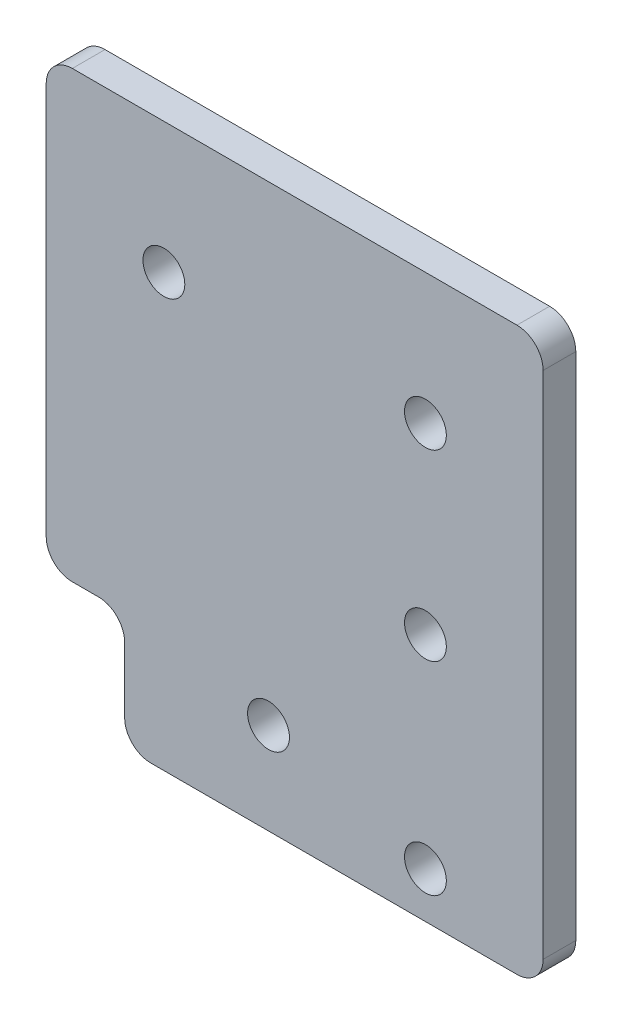
ISO-10303-21;
HEADER;
FILE_DESCRIPTION(('STEP AP214'),'2;1');
FILE_NAME('part.step','',(''),(''),'','','');
FILE_SCHEMA(('AUTOMOTIVE_DESIGN { 1 0 10303 214 1 1 1 1 }'));
ENDSEC;
DATA;
#1=APPLICATION_CONTEXT('core data for automotive mechanical design processes');
#2=APPLICATION_PROTOCOL_DEFINITION('international standard','automotive_design',2000,#1);
#3=PRODUCT_CONTEXT('',#1,'mechanical');
#4=PRODUCT('Part','Part','',(#3));
#5=PRODUCT_RELATED_PRODUCT_CATEGORY('part','',(#4));
#6=PRODUCT_DEFINITION_FORMATION('','',#4);
#7=PRODUCT_DEFINITION_CONTEXT('part definition',#1,'design');
#8=PRODUCT_DEFINITION('design','',#6,#7);
#9=PRODUCT_DEFINITION_SHAPE('','',#8);
#10=(LENGTH_UNIT() NAMED_UNIT(*) SI_UNIT(.MILLI.,.METRE.));
#11=(NAMED_UNIT(*) PLANE_ANGLE_UNIT() SI_UNIT($,.RADIAN.));
#12=(NAMED_UNIT(*) SI_UNIT($,.STERADIAN.) SOLID_ANGLE_UNIT());
#13=UNCERTAINTY_MEASURE_WITH_UNIT(LENGTH_MEASURE(1.E-05),#10,'distance_accuracy_value','');
#14=(GEOMETRIC_REPRESENTATION_CONTEXT(3) GLOBAL_UNCERTAINTY_ASSIGNED_CONTEXT((#13)) GLOBAL_UNIT_ASSIGNED_CONTEXT((#10,
#11,#12)) REPRESENTATION_CONTEXT('',''));
#15=CARTESIAN_POINT('',(0.,0.,0.));
#16=DIRECTION('',(0.,0.,1.));
#17=DIRECTION('',(1.,0.,0.));
#18=AXIS2_PLACEMENT_3D('',#15,#16,#17);
#19=CARTESIAN_POINT('',(0.,0.,2.5));
#20=DIRECTION('',(0.,0.,1.));
#21=DIRECTION('',(1.,0.,0.));
#22=AXIS2_PLACEMENT_3D('',#19,#20,#21);
#23=PLANE('',#22);
#24=CARTESIAN_POINT('',(10.,-7.,2.5));
#25=DIRECTION('',(0.,0.,1.));
#26=DIRECTION('',(1.,0.,0.));
#27=AXIS2_PLACEMENT_3D('',#24,#25,#26);
#28=CIRCLE('',#27,1.6);
#29=CARTESIAN_POINT('',(11.6,-7.,2.5));
#30=VERTEX_POINT('',#29);
#31=EDGE_CURVE('E453',#30,#30,#28,.T.);
#32=ORIENTED_EDGE('',*,*,#31,.F.);
#33=EDGE_LOOP('',(#32));
#34=FACE_BOUND('',#33,.T.);
#35=CARTESIAN_POINT('',(-9.99999999999999,7.,2.5));
#36=DIRECTION('',(0.,0.,1.));
#37=DIRECTION('',(1.,0.,0.));
#38=AXIS2_PLACEMENT_3D('',#35,#36,#37);
#39=CIRCLE('',#38,1.6);
#40=CARTESIAN_POINT('',(-8.39999999999999,7.,2.5));
#41=VERTEX_POINT('',#40);
#42=EDGE_CURVE('E245',#41,#41,#39,.T.);
#43=ORIENTED_EDGE('',*,*,#42,.F.);
#44=EDGE_LOOP('',(#43));
#45=FACE_BOUND('',#44,.T.);
#46=DIRECTION('',(0.,-1.,0.));
#47=VECTOR('',#46,1.);
#48=CARTESIAN_POINT('',(-13.,-26.,2.5));
#49=LINE('',#48,#47);
#50=CARTESIAN_POINT('',(-13.,-19.,2.5));
#51=VERTEX_POINT('',#50);
#52=CARTESIAN_POINT('',(-13.,-24.,2.5));
#53=VERTEX_POINT('',#52);
#54=EDGE_CURVE('E222',#51,#53,#49,.T.);
#55=ORIENTED_EDGE('',*,*,#54,.T.);
#56=CARTESIAN_POINT('',(-11.,-24.,2.5));
#57=DIRECTION('',(0.,0.,1.));
#58=DIRECTION('',(1.,0.,0.));
#59=AXIS2_PLACEMENT_3D('',#56,#57,#58);
#60=CIRCLE('',#59,2.);
#61=CARTESIAN_POINT('',(-11.,-26.,2.5));
#62=VERTEX_POINT('',#61);
#63=EDGE_CURVE('E186',#53,#62,#60,.T.);
#64=ORIENTED_EDGE('',*,*,#63,.T.);
#65=DIRECTION('',(1.,0.,0.));
#66=VECTOR('',#65,1.);
#67=CARTESIAN_POINT('',(-13.,-26.,2.5));
#68=LINE('',#67,#66);
#69=CARTESIAN_POINT('',(17.,-26.,2.5));
#70=VERTEX_POINT('',#69);
#71=EDGE_CURVE('E149',#62,#70,#68,.T.);
#72=ORIENTED_EDGE('',*,*,#71,.T.);
#73=CARTESIAN_POINT('',(17.,-24.,2.5));
#74=DIRECTION('',(0.,0.,1.));
#75=DIRECTION('',(1.,0.,0.));
#76=AXIS2_PLACEMENT_3D('',#73,#74,#75);
#77=CIRCLE('',#76,2.);
#78=CARTESIAN_POINT('',(19.,-24.,2.5));
#79=VERTEX_POINT('',#78);
#80=EDGE_CURVE('E179',#70,#79,#77,.T.);
#81=ORIENTED_EDGE('',*,*,#80,.T.);
#82=DIRECTION('',(0.,1.,0.));
#83=VECTOR('',#82,1.);
#84=CARTESIAN_POINT('',(19.,17.,2.5));
#85=LINE('',#84,#83);
#86=CARTESIAN_POINT('',(19.,15.,2.5));
#87=VERTEX_POINT('',#86);
#88=EDGE_CURVE('E227',#79,#87,#85,.T.);
#89=ORIENTED_EDGE('',*,*,#88,.T.);
#90=CARTESIAN_POINT('',(17.,15.,2.5));
#91=DIRECTION('',(0.,0.,1.));
#92=DIRECTION('',(1.,0.,0.));
#93=AXIS2_PLACEMENT_3D('',#90,#91,#92);
#94=CIRCLE('',#93,2.);
#95=CARTESIAN_POINT('',(17.,17.,2.5));
#96=VERTEX_POINT('',#95);
#97=EDGE_CURVE('E61',#87,#96,#94,.T.);
#98=ORIENTED_EDGE('',*,*,#97,.T.);
#99=DIRECTION('',(-1.,0.,0.));
#100=VECTOR('',#99,1.);
#101=CARTESIAN_POINT('',(-19.,17.,2.5));
#102=LINE('',#101,#100);
#103=CARTESIAN_POINT('',(-17.,17.,2.5));
#104=VERTEX_POINT('',#103);
#105=EDGE_CURVE('E168',#96,#104,#102,.T.);
#106=ORIENTED_EDGE('',*,*,#105,.T.);
#107=CARTESIAN_POINT('',(-17.,15.,2.5));
#108=DIRECTION('',(0.,0.,1.));
#109=DIRECTION('',(1.,0.,0.));
#110=AXIS2_PLACEMENT_3D('',#107,#108,#109);
#111=CIRCLE('',#110,2.);
#112=CARTESIAN_POINT('',(-19.,15.,2.5));
#113=VERTEX_POINT('',#112);
#114=EDGE_CURVE('E182',#104,#113,#111,.T.);
#115=ORIENTED_EDGE('',*,*,#114,.T.);
#116=DIRECTION('',(0.,-1.,0.));
#117=VECTOR('',#116,1.);
#118=CARTESIAN_POINT('',(-19.,17.,2.5));
#119=LINE('',#118,#117);
#120=CARTESIAN_POINT('',(-19.,-15.,2.5));
#121=VERTEX_POINT('',#120);
#122=EDGE_CURVE('E167',#113,#121,#119,.T.);
#123=ORIENTED_EDGE('',*,*,#122,.T.);
#124=CARTESIAN_POINT('',(-17.,-15.,2.5));
#125=DIRECTION('',(0.,0.,1.));
#126=DIRECTION('',(1.,0.,0.));
#127=AXIS2_PLACEMENT_3D('',#124,#125,#126);
#128=CIRCLE('',#127,2.);
#129=CARTESIAN_POINT('',(-17.,-17.,2.5));
#130=VERTEX_POINT('',#129);
#131=EDGE_CURVE('E184',#121,#130,#128,.T.);
#132=ORIENTED_EDGE('',*,*,#131,.T.);
#133=DIRECTION('',(1.,0.,0.));
#134=VECTOR('',#133,1.);
#135=CARTESIAN_POINT('',(-19.,-17.,2.5));
#136=LINE('',#135,#134);
#137=CARTESIAN_POINT('',(-15.,-17.,2.5));
#138=VERTEX_POINT('',#137);
#139=EDGE_CURVE('E223',#130,#138,#136,.T.);
#140=ORIENTED_EDGE('',*,*,#139,.T.);
#141=CARTESIAN_POINT('',(-15.,-19.,2.5));
#142=DIRECTION('',(0.,0.,1.));
#143=DIRECTION('',(1.,0.,0.));
#144=AXIS2_PLACEMENT_3D('',#141,#142,#143);
#145=CIRCLE('',#144,2.);
#146=EDGE_CURVE('E11',#138,#51,#145,.F.);
#147=ORIENTED_EDGE('',*,*,#146,.T.);
#148=EDGE_LOOP('',(#55,#64,#72,#81,#89,#98,#106,#115,#123,#132,#140,#147));
#149=FACE_BOUND('',#148,.T.);
#150=CARTESIAN_POINT('',(10.,6.99999999999999,2.5));
#151=DIRECTION('',(0.,0.,1.));
#152=DIRECTION('',(1.,0.,0.));
#153=AXIS2_PLACEMENT_3D('',#150,#151,#152);
#154=CIRCLE('',#153,1.6);
#155=CARTESIAN_POINT('',(11.6,6.99999999999999,2.5));
#156=VERTEX_POINT('',#155);
#157=EDGE_CURVE('E235',#156,#156,#154,.T.);
#158=ORIENTED_EDGE('',*,*,#157,.F.);
#159=EDGE_LOOP('',(#158));
#160=FACE_BOUND('',#159,.T.);
#161=CARTESIAN_POINT('',(10.,-22.5,2.5));
#162=DIRECTION('',(0.,0.,1.));
#163=DIRECTION('',(1.,0.,0.));
#164=AXIS2_PLACEMENT_3D('',#161,#162,#163);
#165=CIRCLE('',#164,1.6);
#166=CARTESIAN_POINT('',(11.6,-22.5,2.5));
#167=VERTEX_POINT('',#166);
#168=EDGE_CURVE('E457',#167,#167,#165,.T.);
#169=ORIENTED_EDGE('',*,*,#168,.F.);
#170=EDGE_LOOP('',(#169));
#171=FACE_BOUND('',#170,.T.);
#172=CARTESIAN_POINT('',(-1.99999999999999,-19.,2.5));
#173=DIRECTION('',(0.,0.,1.));
#174=DIRECTION('',(1.,0.,0.));
#175=AXIS2_PLACEMENT_3D('',#172,#173,#174);
#176=CIRCLE('',#175,1.6);
#177=CARTESIAN_POINT('',(-0.399999999999992,-19.,2.5));
#178=VERTEX_POINT('',#177);
#179=EDGE_CURVE('E448',#178,#178,#176,.T.);
#180=ORIENTED_EDGE('',*,*,#179,.F.);
#181=EDGE_LOOP('',(#180));
#182=FACE_BOUND('',#181,.T.);
#183=ADVANCED_FACE('F39',(#34,#45,#149,#160,#171,#182),#23,.T.);
#184=CARTESIAN_POINT('',(0.,0.,0.));
#185=DIRECTION('',(0.,0.,1.));
#186=DIRECTION('',(1.,0.,0.));
#187=AXIS2_PLACEMENT_3D('',#184,#185,#186);
#188=PLANE('',#187);
#189=DIRECTION('',(1.,0.,0.));
#190=VECTOR('',#189,1.);
#191=CARTESIAN_POINT('',(-13.,-26.,0.));
#192=LINE('',#191,#190);
#193=CARTESIAN_POINT('',(-11.,-26.,0.));
#194=VERTEX_POINT('',#193);
#195=CARTESIAN_POINT('',(17.,-26.,0.));
#196=VERTEX_POINT('',#195);
#197=EDGE_CURVE('E146',#194,#196,#192,.T.);
#198=ORIENTED_EDGE('',*,*,#197,.F.);
#199=CARTESIAN_POINT('',(-11.,-24.,0.));
#200=DIRECTION('',(0.,0.,1.));
#201=DIRECTION('',(1.,0.,0.));
#202=AXIS2_PLACEMENT_3D('',#199,#200,#201);
#203=CIRCLE('',#202,2.);
#204=CARTESIAN_POINT('',(-13.,-24.,0.));
#205=VERTEX_POINT('',#204);
#206=EDGE_CURVE('E129',#194,#205,#203,.F.);
#207=ORIENTED_EDGE('',*,*,#206,.T.);
#208=DIRECTION('',(0.,-1.,0.));
#209=VECTOR('',#208,1.);
#210=CARTESIAN_POINT('',(-13.,-26.,0.));
#211=LINE('',#210,#209);
#212=CARTESIAN_POINT('',(-13.,-19.,0.));
#213=VERTEX_POINT('',#212);
#214=EDGE_CURVE('E157',#213,#205,#211,.T.);
#215=ORIENTED_EDGE('',*,*,#214,.F.);
#216=CARTESIAN_POINT('',(-15.,-19.,0.));
#217=DIRECTION('',(0.,0.,1.));
#218=DIRECTION('',(1.,0.,0.));
#219=AXIS2_PLACEMENT_3D('',#216,#217,#218);
#220=CIRCLE('',#219,2.);
#221=CARTESIAN_POINT('',(-15.,-17.,0.));
#222=VERTEX_POINT('',#221);
#223=EDGE_CURVE('E47',#213,#222,#220,.T.);
#224=ORIENTED_EDGE('',*,*,#223,.T.);
#225=DIRECTION('',(1.,0.,0.));
#226=VECTOR('',#225,1.);
#227=CARTESIAN_POINT('',(-19.,-17.,0.));
#228=LINE('',#227,#226);
#229=CARTESIAN_POINT('',(-17.,-17.,0.));
#230=VERTEX_POINT('',#229);
#231=EDGE_CURVE('E162',#230,#222,#228,.T.);
#232=ORIENTED_EDGE('',*,*,#231,.F.);
#233=CARTESIAN_POINT('',(-17.,-15.,0.));
#234=DIRECTION('',(0.,0.,1.));
#235=DIRECTION('',(1.,0.,0.));
#236=AXIS2_PLACEMENT_3D('',#233,#234,#235);
#237=CIRCLE('',#236,2.);
#238=CARTESIAN_POINT('',(-19.,-15.,0.));
#239=VERTEX_POINT('',#238);
#240=EDGE_CURVE('E140',#230,#239,#237,.F.);
#241=ORIENTED_EDGE('',*,*,#240,.T.);
#242=DIRECTION('',(0.,-1.,0.));
#243=VECTOR('',#242,1.);
#244=CARTESIAN_POINT('',(-19.,17.,0.));
#245=LINE('',#244,#243);
#246=CARTESIAN_POINT('',(-19.,15.,0.));
#247=VERTEX_POINT('',#246);
#248=EDGE_CURVE('E216',#247,#239,#245,.T.);
#249=ORIENTED_EDGE('',*,*,#248,.F.);
#250=CARTESIAN_POINT('',(-17.,15.,0.));
#251=DIRECTION('',(0.,0.,1.));
#252=DIRECTION('',(1.,0.,0.));
#253=AXIS2_PLACEMENT_3D('',#250,#251,#252);
#254=CIRCLE('',#253,2.);
#255=CARTESIAN_POINT('',(-17.,17.,0.));
#256=VERTEX_POINT('',#255);
#257=EDGE_CURVE('E173',#247,#256,#254,.F.);
#258=ORIENTED_EDGE('',*,*,#257,.T.);
#259=DIRECTION('',(-1.,0.,0.));
#260=VECTOR('',#259,1.);
#261=CARTESIAN_POINT('',(-19.,17.,0.));
#262=LINE('',#261,#260);
#263=CARTESIAN_POINT('',(17.,17.,0.));
#264=VERTEX_POINT('',#263);
#265=EDGE_CURVE('E160',#264,#256,#262,.T.);
#266=ORIENTED_EDGE('',*,*,#265,.F.);
#267=CARTESIAN_POINT('',(17.,15.,0.));
#268=DIRECTION('',(0.,0.,1.));
#269=DIRECTION('',(1.,0.,0.));
#270=AXIS2_PLACEMENT_3D('',#267,#268,#269);
#271=CIRCLE('',#270,2.);
#272=CARTESIAN_POINT('',(19.,15.,0.));
#273=VERTEX_POINT('',#272);
#274=EDGE_CURVE('E171',#264,#273,#271,.F.);
#275=ORIENTED_EDGE('',*,*,#274,.T.);
#276=DIRECTION('',(0.,1.,0.));
#277=VECTOR('',#276,1.);
#278=CARTESIAN_POINT('',(19.,17.,0.));
#279=LINE('',#278,#277);
#280=CARTESIAN_POINT('',(19.,-24.,0.));
#281=VERTEX_POINT('',#280);
#282=EDGE_CURVE('E156',#281,#273,#279,.T.);
#283=ORIENTED_EDGE('',*,*,#282,.F.);
#284=CARTESIAN_POINT('',(17.,-24.,0.));
#285=DIRECTION('',(0.,0.,1.));
#286=DIRECTION('',(1.,0.,0.));
#287=AXIS2_PLACEMENT_3D('',#284,#285,#286);
#288=CIRCLE('',#287,2.);
#289=EDGE_CURVE('E150',#281,#196,#288,.F.);
#290=ORIENTED_EDGE('',*,*,#289,.T.);
#291=EDGE_LOOP('',(#198,#207,#215,#224,#232,#241,#249,#258,#266,#275,#283,#290));
#292=FACE_BOUND('',#291,.T.);
#293=CARTESIAN_POINT('',(10.,6.99999999999999,0.));
#294=DIRECTION('',(0.,0.,1.));
#295=DIRECTION('',(1.,0.,0.));
#296=AXIS2_PLACEMENT_3D('',#293,#294,#295);
#297=CIRCLE('',#296,1.6);
#298=CARTESIAN_POINT('',(11.6,6.99999999999999,0.));
#299=VERTEX_POINT('',#298);
#300=EDGE_CURVE('E240',#299,#299,#297,.T.);
#301=ORIENTED_EDGE('',*,*,#300,.T.);
#302=EDGE_LOOP('',(#301));
#303=FACE_BOUND('',#302,.T.);
#304=CARTESIAN_POINT('',(-9.99999999999999,7.,0.));
#305=DIRECTION('',(0.,0.,1.));
#306=DIRECTION('',(1.,0.,0.));
#307=AXIS2_PLACEMENT_3D('',#304,#305,#306);
#308=CIRCLE('',#307,1.6);
#309=CARTESIAN_POINT('',(-8.39999999999999,7.,0.));
#310=VERTEX_POINT('',#309);
#311=EDGE_CURVE('E248',#310,#310,#308,.T.);
#312=ORIENTED_EDGE('',*,*,#311,.T.);
#313=EDGE_LOOP('',(#312));
#314=FACE_BOUND('',#313,.T.);
#315=CARTESIAN_POINT('',(10.,-22.5,0.));
#316=DIRECTION('',(0.,0.,1.));
#317=DIRECTION('',(1.,0.,0.));
#318=AXIS2_PLACEMENT_3D('',#315,#316,#317);
#319=CIRCLE('',#318,1.6);
#320=CARTESIAN_POINT('',(11.6,-22.5,0.));
#321=VERTEX_POINT('',#320);
#322=EDGE_CURVE('E439',#321,#321,#319,.T.);
#323=ORIENTED_EDGE('',*,*,#322,.T.);
#324=EDGE_LOOP('',(#323));
#325=FACE_BOUND('',#324,.T.);
#326=CARTESIAN_POINT('',(10.,-7.,0.));
#327=DIRECTION('',(0.,0.,1.));
#328=DIRECTION('',(1.,0.,0.));
#329=AXIS2_PLACEMENT_3D('',#326,#327,#328);
#330=CIRCLE('',#329,1.6);
#331=CARTESIAN_POINT('',(11.6,-7.,0.));
#332=VERTEX_POINT('',#331);
#333=EDGE_CURVE('E443',#332,#332,#330,.T.);
#334=ORIENTED_EDGE('',*,*,#333,.T.);
#335=EDGE_LOOP('',(#334));
#336=FACE_BOUND('',#335,.T.);
#337=CARTESIAN_POINT('',(-1.99999999999999,-19.,0.));
#338=DIRECTION('',(0.,0.,1.));
#339=DIRECTION('',(1.,0.,0.));
#340=AXIS2_PLACEMENT_3D('',#337,#338,#339);
#341=CIRCLE('',#340,1.6);
#342=CARTESIAN_POINT('',(-0.399999999999992,-19.,0.));
#343=VERTEX_POINT('',#342);
#344=EDGE_CURVE('E446',#343,#343,#341,.T.);
#345=ORIENTED_EDGE('',*,*,#344,.T.);
#346=EDGE_LOOP('',(#345));
#347=FACE_BOUND('',#346,.T.);
#348=ADVANCED_FACE('F153',(#292,#303,#314,#325,#336,#347),#188,.F.);
#349=CARTESIAN_POINT('',(-19.,17.,2.5));
#350=DIRECTION('',(1.,0.,0.));
#351=DIRECTION('',(0.,0.,-1.));
#352=AXIS2_PLACEMENT_3D('',#349,#350,#351);
#353=PLANE('',#352);
#354=ORIENTED_EDGE('',*,*,#248,.T.);
#355=DIRECTION('',(0.,0.,-1.));
#356=VECTOR('',#355,1.);
#357=CARTESIAN_POINT('',(-19.,-15.,2.5));
#358=LINE('',#357,#356);
#359=EDGE_CURVE('E196',#239,#121,#358,.F.);
#360=ORIENTED_EDGE('',*,*,#359,.T.);
#361=ORIENTED_EDGE('',*,*,#122,.F.);
#362=DIRECTION('',(0.,0.,-1.));
#363=VECTOR('',#362,1.);
#364=CARTESIAN_POINT('',(-19.,15.,2.5));
#365=LINE('',#364,#363);
#366=EDGE_CURVE('E193',#113,#247,#365,.T.);
#367=ORIENTED_EDGE('',*,*,#366,.T.);
#368=EDGE_LOOP('',(#354,#360,#361,#367));
#369=FACE_BOUND('',#368,.T.);
#370=ADVANCED_FACE('F262',(#369),#353,.F.);
#371=CARTESIAN_POINT('',(-19.,-17.,2.5));
#372=DIRECTION('',(0.,1.,0.));
#373=DIRECTION('',(0.,0.,1.));
#374=AXIS2_PLACEMENT_3D('',#371,#372,#373);
#375=PLANE('',#374);
#376=ORIENTED_EDGE('',*,*,#139,.F.);
#377=DIRECTION('',(0.,0.,-1.));
#378=VECTOR('',#377,1.);
#379=CARTESIAN_POINT('',(-17.,-17.,2.5));
#380=LINE('',#379,#378);
#381=EDGE_CURVE('E190',#130,#230,#380,.T.);
#382=ORIENTED_EDGE('',*,*,#381,.T.);
#383=ORIENTED_EDGE('',*,*,#231,.T.);
#384=DIRECTION('',(0.,0.,-1.));
#385=VECTOR('',#384,1.);
#386=CARTESIAN_POINT('',(-15.,-17.,2.5));
#387=LINE('',#386,#385);
#388=EDGE_CURVE('E188',#222,#138,#387,.F.);
#389=ORIENTED_EDGE('',*,*,#388,.T.);
#390=EDGE_LOOP('',(#376,#382,#383,#389));
#391=FACE_BOUND('',#390,.T.);
#392=ADVANCED_FACE('F213',(#391),#375,.F.);
#393=CARTESIAN_POINT('',(-13.,-26.,2.5));
#394=DIRECTION('',(1.,0.,0.));
#395=DIRECTION('',(0.,0.,-1.));
#396=AXIS2_PLACEMENT_3D('',#393,#394,#395);
#397=PLANE('',#396);
#398=ORIENTED_EDGE('',*,*,#214,.T.);
#399=DIRECTION('',(0.,0.,-1.));
#400=VECTOR('',#399,1.);
#401=CARTESIAN_POINT('',(-13.,-24.,2.5));
#402=LINE('',#401,#400);
#403=EDGE_CURVE('E134',#205,#53,#402,.F.);
#404=ORIENTED_EDGE('',*,*,#403,.T.);
#405=ORIENTED_EDGE('',*,*,#54,.F.);
#406=DIRECTION('',(0.,0.,-1.));
#407=VECTOR('',#406,1.);
#408=CARTESIAN_POINT('',(-13.,-19.,0.));
#409=LINE('',#408,#407);
#410=EDGE_CURVE('E139',#51,#213,#409,.T.);
#411=ORIENTED_EDGE('',*,*,#410,.T.);
#412=EDGE_LOOP('',(#398,#404,#405,#411));
#413=FACE_BOUND('',#412,.T.);
#414=ADVANCED_FACE('F225',(#413),#397,.F.);
#415=CARTESIAN_POINT('',(-13.,-26.,2.5));
#416=DIRECTION('',(0.,1.,0.));
#417=DIRECTION('',(0.,0.,1.));
#418=AXIS2_PLACEMENT_3D('',#415,#416,#417);
#419=PLANE('',#418);
#420=ORIENTED_EDGE('',*,*,#71,.F.);
#421=DIRECTION('',(0.,0.,-1.));
#422=VECTOR('',#421,1.);
#423=CARTESIAN_POINT('',(-11.,-26.,2.5));
#424=LINE('',#423,#422);
#425=EDGE_CURVE('E133',#62,#194,#424,.T.);
#426=ORIENTED_EDGE('',*,*,#425,.T.);
#427=ORIENTED_EDGE('',*,*,#197,.T.);
#428=DIRECTION('',(0.,0.,-1.));
#429=VECTOR('',#428,1.);
#430=CARTESIAN_POINT('',(17.,-26.,2.5));
#431=LINE('',#430,#429);
#432=EDGE_CURVE('E151',#196,#70,#431,.F.);
#433=ORIENTED_EDGE('',*,*,#432,.T.);
#434=EDGE_LOOP('',(#420,#426,#427,#433));
#435=FACE_BOUND('',#434,.T.);
#436=ADVANCED_FACE('F145',(#435),#419,.F.);
#437=CARTESIAN_POINT('',(19.,17.,2.5));
#438=DIRECTION('',(-1.,0.,0.));
#439=DIRECTION('',(0.,-1.,0.));
#440=AXIS2_PLACEMENT_3D('',#437,#438,#439);
#441=PLANE('',#440);
#442=ORIENTED_EDGE('',*,*,#282,.T.);
#443=DIRECTION('',(0.,0.,-1.));
#444=VECTOR('',#443,1.);
#445=CARTESIAN_POINT('',(19.,15.,2.5));
#446=LINE('',#445,#444);
#447=EDGE_CURVE('E205',#273,#87,#446,.F.);
#448=ORIENTED_EDGE('',*,*,#447,.T.);
#449=ORIENTED_EDGE('',*,*,#88,.F.);
#450=DIRECTION('',(0.,0.,-1.));
#451=VECTOR('',#450,1.);
#452=CARTESIAN_POINT('',(19.,-24.,2.5));
#453=LINE('',#452,#451);
#454=EDGE_CURVE('E202',#79,#281,#453,.T.);
#455=ORIENTED_EDGE('',*,*,#454,.T.);
#456=EDGE_LOOP('',(#442,#448,#449,#455));
#457=FACE_BOUND('',#456,.T.);
#458=ADVANCED_FACE('F286',(#457),#441,.F.);
#459=CARTESIAN_POINT('',(-19.,17.,2.5));
#460=DIRECTION('',(0.,-1.,0.));
#461=DIRECTION('',(0.,0.,-1.));
#462=AXIS2_PLACEMENT_3D('',#459,#460,#461);
#463=PLANE('',#462);
#464=ORIENTED_EDGE('',*,*,#265,.T.);
#465=DIRECTION('',(0.,0.,-1.));
#466=VECTOR('',#465,1.);
#467=CARTESIAN_POINT('',(-17.,17.,2.5));
#468=LINE('',#467,#466);
#469=EDGE_CURVE('E54',#256,#104,#468,.F.);
#470=ORIENTED_EDGE('',*,*,#469,.T.);
#471=ORIENTED_EDGE('',*,*,#105,.F.);
#472=DIRECTION('',(0.,0.,-1.));
#473=VECTOR('',#472,1.);
#474=CARTESIAN_POINT('',(17.,17.,2.5));
#475=LINE('',#474,#473);
#476=EDGE_CURVE('E198',#96,#264,#475,.T.);
#477=ORIENTED_EDGE('',*,*,#476,.T.);
#478=EDGE_LOOP('',(#464,#470,#471,#477));
#479=FACE_BOUND('',#478,.T.);
#480=ADVANCED_FACE('F259',(#479),#463,.F.);
#481=CARTESIAN_POINT('',(10.,6.99999999999999,2.5));
#482=DIRECTION('',(0.,0.,-1.));
#483=DIRECTION('',(-1.,0.,0.));
#484=AXIS2_PLACEMENT_3D('',#481,#482,#483);
#485=CYLINDRICAL_SURFACE('',#484,1.6);
#486=ORIENTED_EDGE('',*,*,#157,.T.);
#487=EDGE_LOOP('',(#486));
#488=FACE_BOUND('',#487,.T.);
#489=ORIENTED_EDGE('',*,*,#300,.F.);
#490=EDGE_LOOP('',(#489));
#491=FACE_BOUND('',#490,.T.);
#492=ADVANCED_FACE('F281',(#488,#491),#485,.F.);
#493=CARTESIAN_POINT('',(-9.99999999999999,7.,2.5));
#494=DIRECTION('',(0.,0.,-1.));
#495=DIRECTION('',(-1.,0.,0.));
#496=AXIS2_PLACEMENT_3D('',#493,#494,#495);
#497=CYLINDRICAL_SURFACE('',#496,1.6);
#498=ORIENTED_EDGE('',*,*,#42,.T.);
#499=EDGE_LOOP('',(#498));
#500=FACE_BOUND('',#499,.T.);
#501=ORIENTED_EDGE('',*,*,#311,.F.);
#502=EDGE_LOOP('',(#501));
#503=FACE_BOUND('',#502,.T.);
#504=ADVANCED_FACE('F387',(#500,#503),#497,.F.);
#505=CARTESIAN_POINT('',(10.,-22.5,2.5));
#506=DIRECTION('',(0.,0.,-1.));
#507=DIRECTION('',(-1.,0.,0.));
#508=AXIS2_PLACEMENT_3D('',#505,#506,#507);
#509=CYLINDRICAL_SURFACE('',#508,1.6);
#510=ORIENTED_EDGE('',*,*,#168,.T.);
#511=EDGE_LOOP('',(#510));
#512=FACE_BOUND('',#511,.T.);
#513=ORIENTED_EDGE('',*,*,#322,.F.);
#514=EDGE_LOOP('',(#513));
#515=FACE_BOUND('',#514,.T.);
#516=ADVANCED_FACE('F378',(#512,#515),#509,.F.);
#517=CARTESIAN_POINT('',(10.,-7.,2.5));
#518=DIRECTION('',(0.,0.,-1.));
#519=DIRECTION('',(-1.,0.,0.));
#520=AXIS2_PLACEMENT_3D('',#517,#518,#519);
#521=CYLINDRICAL_SURFACE('',#520,1.6);
#522=ORIENTED_EDGE('',*,*,#31,.T.);
#523=EDGE_LOOP('',(#522));
#524=FACE_BOUND('',#523,.T.);
#525=ORIENTED_EDGE('',*,*,#333,.F.);
#526=EDGE_LOOP('',(#525));
#527=FACE_BOUND('',#526,.T.);
#528=ADVANCED_FACE('F369',(#524,#527),#521,.F.);
#529=CARTESIAN_POINT('',(-1.99999999999999,-19.,2.5));
#530=DIRECTION('',(0.,0.,-1.));
#531=DIRECTION('',(-1.,0.,0.));
#532=AXIS2_PLACEMENT_3D('',#529,#530,#531);
#533=CYLINDRICAL_SURFACE('',#532,1.6);
#534=ORIENTED_EDGE('',*,*,#179,.T.);
#535=EDGE_LOOP('',(#534));
#536=FACE_BOUND('',#535,.T.);
#537=ORIENTED_EDGE('',*,*,#344,.F.);
#538=EDGE_LOOP('',(#537));
#539=FACE_BOUND('',#538,.T.);
#540=ADVANCED_FACE('F320',(#536,#539),#533,.F.);
#541=CARTESIAN_POINT('',(-11.,-24.,2.5));
#542=DIRECTION('',(0.,0.,-1.));
#543=DIRECTION('',(-1.,0.,0.));
#544=AXIS2_PLACEMENT_3D('',#541,#542,#543);
#545=CYLINDRICAL_SURFACE('',#544,2.);
#546=ORIENTED_EDGE('',*,*,#63,.F.);
#547=ORIENTED_EDGE('',*,*,#403,.F.);
#548=ORIENTED_EDGE('',*,*,#206,.F.);
#549=ORIENTED_EDGE('',*,*,#425,.F.);
#550=EDGE_LOOP('',(#546,#547,#548,#549));
#551=FACE_BOUND('',#550,.T.);
#552=ADVANCED_FACE('F132',(#551),#545,.T.);
#553=CARTESIAN_POINT('',(-17.,-15.,2.5));
#554=DIRECTION('',(0.,0.,-1.));
#555=DIRECTION('',(-1.,0.,0.));
#556=AXIS2_PLACEMENT_3D('',#553,#554,#555);
#557=CYLINDRICAL_SURFACE('',#556,2.);
#558=ORIENTED_EDGE('',*,*,#131,.F.);
#559=ORIENTED_EDGE('',*,*,#359,.F.);
#560=ORIENTED_EDGE('',*,*,#240,.F.);
#561=ORIENTED_EDGE('',*,*,#381,.F.);
#562=EDGE_LOOP('',(#558,#559,#560,#561));
#563=FACE_BOUND('',#562,.T.);
#564=ADVANCED_FACE('F256',(#563),#557,.T.);
#565=CARTESIAN_POINT('',(-15.,-19.,2.5));
#566=DIRECTION('',(0.,0.,1.));
#567=DIRECTION('',(1.,0.,0.));
#568=AXIS2_PLACEMENT_3D('',#565,#566,#567);
#569=CYLINDRICAL_SURFACE('',#568,2.);
#570=ORIENTED_EDGE('',*,*,#146,.F.);
#571=ORIENTED_EDGE('',*,*,#388,.F.);
#572=ORIENTED_EDGE('',*,*,#223,.F.);
#573=ORIENTED_EDGE('',*,*,#410,.F.);
#574=EDGE_LOOP('',(#570,#571,#572,#573));
#575=FACE_BOUND('',#574,.T.);
#576=ADVANCED_FACE('F218',(#575),#569,.F.);
#577=CARTESIAN_POINT('',(-17.,15.,2.5));
#578=DIRECTION('',(0.,0.,-1.));
#579=DIRECTION('',(-1.,0.,0.));
#580=AXIS2_PLACEMENT_3D('',#577,#578,#579);
#581=CYLINDRICAL_SURFACE('',#580,2.);
#582=ORIENTED_EDGE('',*,*,#114,.F.);
#583=ORIENTED_EDGE('',*,*,#469,.F.);
#584=ORIENTED_EDGE('',*,*,#257,.F.);
#585=ORIENTED_EDGE('',*,*,#366,.F.);
#586=EDGE_LOOP('',(#582,#583,#584,#585));
#587=FACE_BOUND('',#586,.T.);
#588=ADVANCED_FACE('F261',(#587),#581,.T.);
#589=CARTESIAN_POINT('',(17.,15.,2.5));
#590=DIRECTION('',(0.,0.,-1.));
#591=DIRECTION('',(-1.,0.,0.));
#592=AXIS2_PLACEMENT_3D('',#589,#590,#591);
#593=CYLINDRICAL_SURFACE('',#592,2.);
#594=ORIENTED_EDGE('',*,*,#97,.F.);
#595=ORIENTED_EDGE('',*,*,#447,.F.);
#596=ORIENTED_EDGE('',*,*,#274,.F.);
#597=ORIENTED_EDGE('',*,*,#476,.F.);
#598=EDGE_LOOP('',(#594,#595,#596,#597));
#599=FACE_BOUND('',#598,.T.);
#600=ADVANCED_FACE('F342',(#599),#593,.T.);
#601=CARTESIAN_POINT('',(17.,-24.,2.5));
#602=DIRECTION('',(0.,0.,-1.));
#603=DIRECTION('',(-1.,0.,0.));
#604=AXIS2_PLACEMENT_3D('',#601,#602,#603);
#605=CYLINDRICAL_SURFACE('',#604,2.);
#606=ORIENTED_EDGE('',*,*,#80,.F.);
#607=ORIENTED_EDGE('',*,*,#432,.F.);
#608=ORIENTED_EDGE('',*,*,#289,.F.);
#609=ORIENTED_EDGE('',*,*,#454,.F.);
#610=EDGE_LOOP('',(#606,#607,#608,#609));
#611=FACE_BOUND('',#610,.T.);
#612=ADVANCED_FACE('F41',(#611),#605,.T.);
#613=CLOSED_SHELL('',(#183,#348,#370,#392,#414,#436,#458,#480,#492,#504,#516,#528,#540,#552,
#564,#576,#588,#600,#612));
#614=MANIFOLD_SOLID_BREP('B2',#613);
#615=ADVANCED_BREP_SHAPE_REPRESENTATION('',(#18,#614),#14);
#616=SHAPE_DEFINITION_REPRESENTATION(#9,#615);
ENDSEC;
END-ISO-10303-21;
